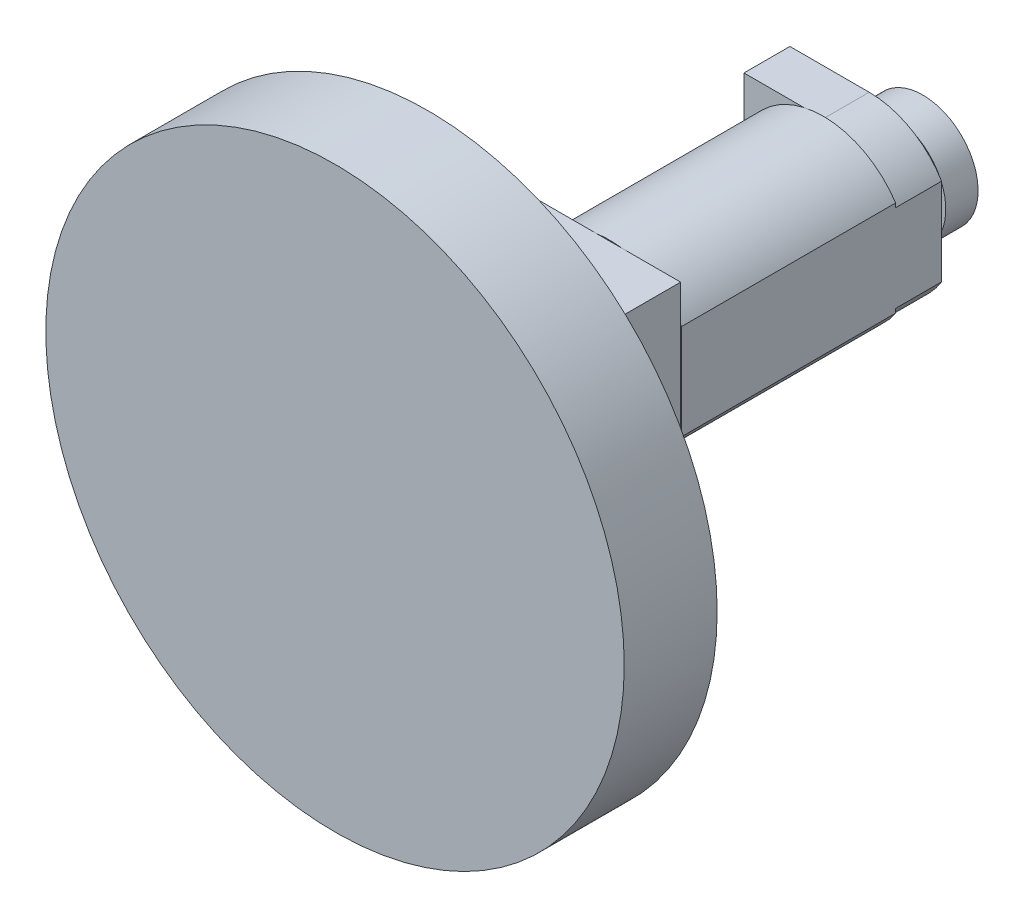
ISO-10303-21;
HEADER;
FILE_DESCRIPTION(('STEP AP214'),'2;1');
FILE_NAME('part.step','',(''),(''),'','','');
FILE_SCHEMA(('AUTOMOTIVE_DESIGN { 1 0 10303 214 1 1 1 1 }'));
ENDSEC;
DATA;
#1=APPLICATION_CONTEXT('core data for automotive mechanical design processes');
#2=APPLICATION_PROTOCOL_DEFINITION('international standard','automotive_design',2000,#1);
#3=PRODUCT_CONTEXT('',#1,'mechanical');
#4=PRODUCT('Part','Part','',(#3));
#5=PRODUCT_RELATED_PRODUCT_CATEGORY('part','',(#4));
#6=PRODUCT_DEFINITION_FORMATION('','',#4);
#7=PRODUCT_DEFINITION_CONTEXT('part definition',#1,'design');
#8=PRODUCT_DEFINITION('design','',#6,#7);
#9=PRODUCT_DEFINITION_SHAPE('','',#8);
#10=(LENGTH_UNIT() NAMED_UNIT(*) SI_UNIT(.MILLI.,.METRE.));
#11=(NAMED_UNIT(*) PLANE_ANGLE_UNIT() SI_UNIT($,.RADIAN.));
#12=(NAMED_UNIT(*) SI_UNIT($,.STERADIAN.) SOLID_ANGLE_UNIT());
#13=UNCERTAINTY_MEASURE_WITH_UNIT(LENGTH_MEASURE(1.E-05),#10,'distance_accuracy_value','');
#14=(GEOMETRIC_REPRESENTATION_CONTEXT(3) GLOBAL_UNCERTAINTY_ASSIGNED_CONTEXT((#13)) GLOBAL_UNIT_ASSIGNED_CONTEXT((#10,
#11,#12)) REPRESENTATION_CONTEXT('',''));
#15=CARTESIAN_POINT('',(0.,0.,0.));
#16=DIRECTION('',(0.,0.,1.));
#17=DIRECTION('',(1.,0.,0.));
#18=AXIS2_PLACEMENT_3D('',#15,#16,#17);
#19=CARTESIAN_POINT('',(0.,0.,0.));
#20=DIRECTION('',(0.,0.,1.));
#21=DIRECTION('',(1.,0.,0.));
#22=AXIS2_PLACEMENT_3D('',#19,#20,#21);
#23=PLANE('',#22);
#24=CARTESIAN_POINT('',(0.,0.,0.));
#25=DIRECTION('',(0.,0.,-1.));
#26=DIRECTION('',(-1.,0.,0.));
#27=AXIS2_PLACEMENT_3D('',#24,#25,#26);
#28=CIRCLE('',#27,5.842);
#29=CARTESIAN_POINT('',(0.,5.842,0.));
#30=VERTEX_POINT('',#29);
#31=CARTESIAN_POINT('',(5.0038,3.01512015680967,0.));
#32=VERTEX_POINT('',#31);
#33=EDGE_CURVE('E64',#30,#32,#28,.T.);
#34=ORIENTED_EDGE('',*,*,#33,.F.);
#35=DIRECTION('',(-1.,0.,0.));
#36=VECTOR('',#35,1.);
#37=CARTESIAN_POINT('',(0.,5.842,0.));
#38=LINE('',#37,#36);
#39=CARTESIAN_POINT('',(-1.34308129314647,5.842,0.));
#40=VERTEX_POINT('',#39);
#41=EDGE_CURVE('E223',#30,#40,#38,.T.);
#42=ORIENTED_EDGE('',*,*,#41,.T.);
#43=CARTESIAN_POINT('',(0.,0.,0.));
#44=DIRECTION('',(0.,0.,1.));
#45=DIRECTION('',(1.,0.,0.));
#46=AXIS2_PLACEMENT_3D('',#43,#44,#45);
#47=CIRCLE('',#46,5.9944);
#48=CARTESIAN_POINT('',(5.0038,3.30072975567525,0.));
#49=VERTEX_POINT('',#48);
#50=EDGE_CURVE('E329',#49,#40,#47,.T.);
#51=ORIENTED_EDGE('',*,*,#50,.F.);
#52=DIRECTION('',(0.,1.,0.));
#53=VECTOR('',#52,1.);
#54=CARTESIAN_POINT('',(5.0038,3.30072975567525,0.));
#55=LINE('',#54,#53);
#56=EDGE_CURVE('E234',#32,#49,#55,.T.);
#57=ORIENTED_EDGE('',*,*,#56,.F.);
#58=EDGE_LOOP('',(#34,#42,#51,#57));
#59=FACE_BOUND('',#58,.T.);
#60=ADVANCED_FACE('F37',(#59),#23,.F.);
#61=CARTESIAN_POINT('',(0.,0.,33.7693));
#62=DIRECTION('',(0.,0.,-1.));
#63=DIRECTION('',(-1.,0.,0.));
#64=AXIS2_PLACEMENT_3D('',#61,#62,#63);
#65=CYLINDRICAL_SURFACE('',#64,1.4732);
#66=CARTESIAN_POINT('',(0.,0.,27.3431));
#67=DIRECTION('',(0.,0.,1.));
#68=DIRECTION('',(1.,0.,0.));
#69=AXIS2_PLACEMENT_3D('',#66,#67,#68);
#70=CIRCLE('',#69,1.4732);
#71=CARTESIAN_POINT('',(1.1129722368505,-0.9652,27.3431));
#72=VERTEX_POINT('',#71);
#73=CARTESIAN_POINT('',(-1.1129722368505,-0.9652,27.3431));
#74=VERTEX_POINT('',#73);
#75=EDGE_CURVE('E255',#72,#74,#70,.T.);
#76=ORIENTED_EDGE('',*,*,#75,.F.);
#77=DIRECTION('',(0.,0.,-1.));
#78=VECTOR('',#77,1.);
#79=CARTESIAN_POINT('',(1.1129722368505,-0.9652,33.7693));
#80=LINE('',#79,#78);
#81=CARTESIAN_POINT('',(1.1129722368505,-0.9652,23.8252));
#82=VERTEX_POINT('',#81);
#83=EDGE_CURVE('E273',#72,#82,#80,.T.);
#84=ORIENTED_EDGE('',*,*,#83,.T.);
#85=CARTESIAN_POINT('',(0.,0.,23.8252));
#86=DIRECTION('',(0.,0.,1.));
#87=DIRECTION('',(1.,0.,0.));
#88=AXIS2_PLACEMENT_3D('',#85,#86,#87);
#89=CIRCLE('',#88,1.4732);
#90=CARTESIAN_POINT('',(-1.1129722368505,-0.9652,23.8252));
#91=VERTEX_POINT('',#90);
#92=EDGE_CURVE('E265',#82,#91,#89,.T.);
#93=ORIENTED_EDGE('',*,*,#92,.T.);
#94=DIRECTION('',(0.,0.,-1.));
#95=VECTOR('',#94,1.);
#96=CARTESIAN_POINT('',(-1.1129722368505,-0.9652,33.7693));
#97=LINE('',#96,#95);
#98=EDGE_CURVE('E275',#74,#91,#97,.T.);
#99=ORIENTED_EDGE('',*,*,#98,.F.);
#100=EDGE_LOOP('',(#76,#84,#93,#99));
#101=FACE_BOUND('',#100,.T.);
#102=ADVANCED_FACE('F392',(#101),#65,.T.);
#103=CARTESIAN_POINT('',(-1.1129722368505,-0.9652,33.7693));
#104=DIRECTION('',(0.,1.,0.));
#105=DIRECTION('',(0.,0.,1.));
#106=AXIS2_PLACEMENT_3D('',#103,#104,#105);
#107=PLANE('',#106);
#108=DIRECTION('',(1.,0.,0.));
#109=VECTOR('',#108,1.);
#110=CARTESIAN_POINT('',(-1.1129722368505,-0.9652,27.3431));
#111=LINE('',#110,#109);
#112=EDGE_CURVE('E258',#74,#72,#111,.T.);
#113=ORIENTED_EDGE('',*,*,#112,.F.);
#114=ORIENTED_EDGE('',*,*,#98,.T.);
#115=DIRECTION('',(1.,0.,0.));
#116=VECTOR('',#115,1.);
#117=CARTESIAN_POINT('',(-1.1129722368505,-0.9652,23.8252));
#118=LINE('',#117,#116);
#119=EDGE_CURVE('E270',#91,#82,#118,.T.);
#120=ORIENTED_EDGE('',*,*,#119,.T.);
#121=ORIENTED_EDGE('',*,*,#83,.F.);
#122=EDGE_LOOP('',(#113,#114,#120,#121));
#123=FACE_BOUND('',#122,.T.);
#124=ADVANCED_FACE('F398',(#123),#107,.F.);
#125=CARTESIAN_POINT('',(0.,0.,23.8252));
#126=DIRECTION('',(0.,0.,1.));
#127=DIRECTION('',(1.,0.,0.));
#128=AXIS2_PLACEMENT_3D('',#125,#126,#127);
#129=PLANE('',#128);
#130=DIRECTION('',(0.,-1.,0.));
#131=VECTOR('',#130,1.);
#132=CARTESIAN_POINT('',(-4.9403,5.9309,23.8252));
#133=LINE('',#132,#131);
#134=CARTESIAN_POINT('',(-4.9403,5.9309,23.8252));
#135=VERTEX_POINT('',#134);
#136=CARTESIAN_POINT('',(-4.9403,-5.9309,23.8252));
#137=VERTEX_POINT('',#136);
#138=EDGE_CURVE('E277',#135,#137,#133,.T.);
#139=ORIENTED_EDGE('',*,*,#138,.T.);
#140=DIRECTION('',(1.,0.,0.));
#141=VECTOR('',#140,1.);
#142=CARTESIAN_POINT('',(-4.9403,-5.9309,23.8252));
#143=LINE('',#142,#141);
#144=CARTESIAN_POINT('',(4.9403,-5.9309,23.8252));
#145=VERTEX_POINT('',#144);
#146=EDGE_CURVE('E280',#137,#145,#143,.T.);
#147=ORIENTED_EDGE('',*,*,#146,.T.);
#148=DIRECTION('',(0.,1.,0.));
#149=VECTOR('',#148,1.);
#150=CARTESIAN_POINT('',(4.9403,5.9309,23.8252));
#151=LINE('',#150,#149);
#152=CARTESIAN_POINT('',(4.9403,5.9309,23.8252));
#153=VERTEX_POINT('',#152);
#154=EDGE_CURVE('E283',#145,#153,#151,.T.);
#155=ORIENTED_EDGE('',*,*,#154,.T.);
#156=DIRECTION('',(-1.,0.,0.));
#157=VECTOR('',#156,1.);
#158=CARTESIAN_POINT('',(-4.9403,5.9309,23.8252));
#159=LINE('',#158,#157);
#160=EDGE_CURVE('E285',#153,#135,#159,.T.);
#161=ORIENTED_EDGE('',*,*,#160,.T.);
#162=EDGE_LOOP('',(#139,#147,#155,#161));
#163=FACE_BOUND('',#162,.T.);
#164=ORIENTED_EDGE('',*,*,#119,.F.);
#165=ORIENTED_EDGE('',*,*,#92,.F.);
#166=EDGE_LOOP('',(#164,#165));
#167=FACE_BOUND('',#166,.T.);
#168=ADVANCED_FACE('F425',(#163,#167),#129,.T.);
#169=CARTESIAN_POINT('',(0.,0.,14.8082));
#170=DIRECTION('',(0.,0.,1.));
#171=DIRECTION('',(1.,0.,0.));
#172=AXIS2_PLACEMENT_3D('',#169,#170,#171);
#173=PLANE('',#172);
#174=DIRECTION('',(0.,-1.,0.));
#175=VECTOR('',#174,1.);
#176=CARTESIAN_POINT('',(-4.9403,5.9309,14.8082));
#177=LINE('',#176,#175);
#178=CARTESIAN_POINT('',(-4.9403,3.39503568022488,14.8082));
#179=VERTEX_POINT('',#178);
#180=CARTESIAN_POINT('',(-4.9403,-3.39503568022488,14.8082));
#181=VERTEX_POINT('',#180);
#182=EDGE_CURVE('E11',#179,#181,#177,.T.);
#183=ORIENTED_EDGE('',*,*,#182,.F.);
#184=CARTESIAN_POINT('',(0.,0.,14.8082));
#185=DIRECTION('',(0.,0.,1.));
#186=DIRECTION('',(1.,0.,0.));
#187=AXIS2_PLACEMENT_3D('',#184,#185,#186);
#188=CIRCLE('',#187,5.9944);
#189=CARTESIAN_POINT('',(-5.0038,3.30072975567525,14.8082));
#190=VERTEX_POINT('',#189);
#191=EDGE_CURVE('E319',#179,#190,#188,.T.);
#192=ORIENTED_EDGE('',*,*,#191,.T.);
#193=DIRECTION('',(0.,-1.,0.));
#194=VECTOR('',#193,1.);
#195=CARTESIAN_POINT('',(-5.0038,3.30072975567525,14.8082));
#196=LINE('',#195,#194);
#197=CARTESIAN_POINT('',(-5.0038,-3.30072975567525,14.8082));
#198=VERTEX_POINT('',#197);
#199=EDGE_CURVE('E317',#190,#198,#196,.T.);
#200=ORIENTED_EDGE('',*,*,#199,.T.);
#201=CARTESIAN_POINT('',(0.,0.,14.8082));
#202=DIRECTION('',(0.,0.,1.));
#203=DIRECTION('',(1.,0.,0.));
#204=AXIS2_PLACEMENT_3D('',#201,#202,#203);
#205=CIRCLE('',#204,5.9944);
#206=EDGE_CURVE('E322',#198,#181,#205,.T.);
#207=ORIENTED_EDGE('',*,*,#206,.T.);
#208=EDGE_LOOP('',(#183,#192,#200,#207));
#209=FACE_BOUND('',#208,.T.);
#210=ADVANCED_FACE('F416',(#209),#173,.T.);
#211=DIRECTION('',(-1.,0.,0.));
#212=VECTOR('',#211,1.);
#213=CARTESIAN_POINT('',(-4.9403,5.9309,14.8082));
#214=LINE('',#213,#212);
#215=CARTESIAN_POINT('',(0.870204889666792,5.9309,14.8082));
#216=VERTEX_POINT('',#215);
#217=CARTESIAN_POINT('',(-0.870204889666792,5.9309,14.8082));
#218=VERTEX_POINT('',#217);
#219=EDGE_CURVE('E46',#216,#218,#214,.T.);
#220=ORIENTED_EDGE('',*,*,#219,.F.);
#221=EDGE_CURVE('E475',#216,#218,#188,.T.);
#222=ORIENTED_EDGE('',*,*,#221,.T.);
#223=EDGE_LOOP('',(#220,#222));
#224=FACE_BOUND('',#223,.T.);
#225=ADVANCED_FACE('F424',(#224),#173,.T.);
#226=DIRECTION('',(0.,1.,0.));
#227=VECTOR('',#226,1.);
#228=CARTESIAN_POINT('',(4.9403,5.9309,14.8082));
#229=LINE('',#228,#227);
#230=CARTESIAN_POINT('',(4.9403,-3.39503568022488,14.8082));
#231=VERTEX_POINT('',#230);
#232=CARTESIAN_POINT('',(4.9403,3.39503568022488,14.8082));
#233=VERTEX_POINT('',#232);
#234=EDGE_CURVE('E299',#231,#233,#229,.T.);
#235=ORIENTED_EDGE('',*,*,#234,.F.);
#236=CARTESIAN_POINT('',(5.0038,-3.30072975567525,14.8082));
#237=VERTEX_POINT('',#236);
#238=EDGE_CURVE('E321',#231,#237,#205,.T.);
#239=ORIENTED_EDGE('',*,*,#238,.T.);
#240=DIRECTION('',(0.,1.,0.));
#241=VECTOR('',#240,1.);
#242=CARTESIAN_POINT('',(5.0038,3.30072975567525,14.8082));
#243=LINE('',#242,#241);
#244=CARTESIAN_POINT('',(5.0038,3.30072975567525,14.8082));
#245=VERTEX_POINT('',#244);
#246=EDGE_CURVE('E325',#237,#245,#243,.T.);
#247=ORIENTED_EDGE('',*,*,#246,.T.);
#248=EDGE_CURVE('E314',#245,#233,#188,.T.);
#249=ORIENTED_EDGE('',*,*,#248,.T.);
#250=EDGE_LOOP('',(#235,#239,#247,#249));
#251=FACE_BOUND('',#250,.T.);
#252=ADVANCED_FACE('F417',(#251),#173,.T.);
#253=CARTESIAN_POINT('',(0.,0.,14.8082));
#254=DIRECTION('',(0.,0.,-1.));
#255=DIRECTION('',(-1.,0.,0.));
#256=AXIS2_PLACEMENT_3D('',#253,#254,#255);
#257=CYLINDRICAL_SURFACE('',#256,5.9944);
#258=ORIENTED_EDGE('',*,*,#50,.T.);
#259=CARTESIAN_POINT('',(-5.0038,3.30072975567525,0.));
#260=VERTEX_POINT('',#259);
#261=EDGE_CURVE('E313',#40,#260,#47,.T.);
#262=ORIENTED_EDGE('',*,*,#261,.T.);
#263=DIRECTION('',(0.,0.,-1.));
#264=VECTOR('',#263,1.);
#265=CARTESIAN_POINT('',(-5.0038,3.30072975567525,14.8082));
#266=LINE('',#265,#264);
#267=EDGE_CURVE('E344',#190,#260,#266,.T.);
#268=ORIENTED_EDGE('',*,*,#267,.F.);
#269=ORIENTED_EDGE('',*,*,#191,.F.);
#270=EDGE_CURVE('E470',#218,#179,#188,.T.);
#271=ORIENTED_EDGE('',*,*,#270,.F.);
#272=ORIENTED_EDGE('',*,*,#221,.F.);
#273=EDGE_CURVE('E318',#233,#216,#188,.T.);
#274=ORIENTED_EDGE('',*,*,#273,.F.);
#275=ORIENTED_EDGE('',*,*,#248,.F.);
#276=DIRECTION('',(0.,0.,-1.));
#277=VECTOR('',#276,1.);
#278=CARTESIAN_POINT('',(5.0038,3.30072975567525,14.8082));
#279=LINE('',#278,#277);
#280=EDGE_CURVE('E328',#245,#49,#279,.T.);
#281=ORIENTED_EDGE('',*,*,#280,.T.);
#282=EDGE_LOOP('',(#258,#262,#268,#269,#271,#272,#274,#275,#281));
#283=FACE_BOUND('',#282,.T.);
#284=ADVANCED_FACE('F39',(#283),#257,.T.);
#285=CARTESIAN_POINT('',(-5.0038,3.30072975567525,14.8082));
#286=DIRECTION('',(1.,0.,0.));
#287=DIRECTION('',(0.,0.,-1.));
#288=AXIS2_PLACEMENT_3D('',#285,#286,#287);
#289=PLANE('',#288);
#290=DIRECTION('',(0.,-1.,0.));
#291=VECTOR('',#290,1.);
#292=CARTESIAN_POINT('',(-5.0038,3.30072975567525,0.));
#293=LINE('',#292,#291);
#294=CARTESIAN_POINT('',(-5.0038,-3.30072975567525,0.));
#295=VERTEX_POINT('',#294);
#296=EDGE_CURVE('E332',#260,#295,#293,.T.);
#297=ORIENTED_EDGE('',*,*,#296,.T.);
#298=DIRECTION('',(0.,0.,-1.));
#299=VECTOR('',#298,1.);
#300=CARTESIAN_POINT('',(-5.0038,-3.30072975567525,14.8082));
#301=LINE('',#300,#299);
#302=EDGE_CURVE('E347',#198,#295,#301,.T.);
#303=ORIENTED_EDGE('',*,*,#302,.F.);
#304=ORIENTED_EDGE('',*,*,#199,.F.);
#305=ORIENTED_EDGE('',*,*,#267,.T.);
#306=EDGE_LOOP('',(#297,#303,#304,#305));
#307=FACE_BOUND('',#306,.T.);
#308=ADVANCED_FACE('F433',(#307),#289,.F.);
#309=CARTESIAN_POINT('',(0.,0.,14.8082));
#310=DIRECTION('',(0.,0.,-1.));
#311=DIRECTION('',(-1.,0.,0.));
#312=AXIS2_PLACEMENT_3D('',#309,#310,#311);
#313=CYLINDRICAL_SURFACE('',#312,5.9944);
#314=CARTESIAN_POINT('',(0.,0.,0.));
#315=DIRECTION('',(0.,0.,1.));
#316=DIRECTION('',(1.,0.,0.));
#317=AXIS2_PLACEMENT_3D('',#314,#315,#316);
#318=CIRCLE('',#317,5.9944);
#319=CARTESIAN_POINT('',(-1.34308129314647,-5.842,0.));
#320=VERTEX_POINT('',#319);
#321=EDGE_CURVE('E335',#295,#320,#318,.T.);
#322=ORIENTED_EDGE('',*,*,#321,.T.);
#323=CARTESIAN_POINT('',(5.0038,-3.30072975567525,0.));
#324=VERTEX_POINT('',#323);
#325=EDGE_CURVE('E334',#320,#324,#318,.T.);
#326=ORIENTED_EDGE('',*,*,#325,.T.);
#327=DIRECTION('',(0.,0.,-1.));
#328=VECTOR('',#327,1.);
#329=CARTESIAN_POINT('',(5.0038,-3.30072975567525,14.8082));
#330=LINE('',#329,#328);
#331=EDGE_CURVE('E349',#237,#324,#330,.T.);
#332=ORIENTED_EDGE('',*,*,#331,.F.);
#333=ORIENTED_EDGE('',*,*,#238,.F.);
#334=CARTESIAN_POINT('',(0.870204889666792,-5.9309,14.8082));
#335=VERTEX_POINT('',#334);
#336=EDGE_CURVE('E443',#335,#231,#205,.T.);
#337=ORIENTED_EDGE('',*,*,#336,.F.);
#338=CARTESIAN_POINT('',(-0.870204889666792,-5.9309,14.8082));
#339=VERTEX_POINT('',#338);
#340=EDGE_CURVE('E448',#339,#335,#205,.T.);
#341=ORIENTED_EDGE('',*,*,#340,.F.);
#342=EDGE_CURVE('E326',#181,#339,#205,.T.);
#343=ORIENTED_EDGE('',*,*,#342,.F.);
#344=ORIENTED_EDGE('',*,*,#206,.F.);
#345=ORIENTED_EDGE('',*,*,#302,.T.);
#346=EDGE_LOOP('',(#322,#326,#332,#333,#337,#341,#343,#344,#345));
#347=FACE_BOUND('',#346,.T.);
#348=ADVANCED_FACE('F421',(#347),#313,.T.);
#349=CARTESIAN_POINT('',(5.0038,3.30072975567525,14.8082));
#350=DIRECTION('',(-1.,0.,0.));
#351=DIRECTION('',(0.,0.,1.));
#352=AXIS2_PLACEMENT_3D('',#349,#350,#351);
#353=PLANE('',#352);
#354=CARTESIAN_POINT('',(5.0038,-3.01512015680968,0.));
#355=VERTEX_POINT('',#354);
#356=EDGE_CURVE('E341',#324,#355,#55,.T.);
#357=ORIENTED_EDGE('',*,*,#356,.T.);
#358=DIRECTION('',(0.,0.,1.));
#359=VECTOR('',#358,1.);
#360=CARTESIAN_POINT('',(5.0038,-3.01512015680968,-3.175));
#361=LINE('',#360,#359);
#362=CARTESIAN_POINT('',(5.0038,-3.01512015680968,-3.175));
#363=VERTEX_POINT('',#362);
#364=EDGE_CURVE('E240',#363,#355,#361,.T.);
#365=ORIENTED_EDGE('',*,*,#364,.F.);
#366=DIRECTION('',(0.,-1.,0.));
#367=VECTOR('',#366,1.);
#368=CARTESIAN_POINT('',(5.0038,3.01512015680967,-3.175));
#369=LINE('',#368,#367);
#370=CARTESIAN_POINT('',(5.0038,3.01512015680967,-3.175));
#371=VERTEX_POINT('',#370);
#372=EDGE_CURVE('E220',#371,#363,#369,.T.);
#373=ORIENTED_EDGE('',*,*,#372,.F.);
#374=DIRECTION('',(0.,0.,1.));
#375=VECTOR('',#374,1.);
#376=CARTESIAN_POINT('',(5.0038,3.01512015680967,-3.175));
#377=LINE('',#376,#375);
#378=EDGE_CURVE('E237',#371,#32,#377,.T.);
#379=ORIENTED_EDGE('',*,*,#378,.T.);
#380=ORIENTED_EDGE('',*,*,#56,.T.);
#381=ORIENTED_EDGE('',*,*,#280,.F.);
#382=ORIENTED_EDGE('',*,*,#246,.F.);
#383=ORIENTED_EDGE('',*,*,#331,.T.);
#384=EDGE_LOOP('',(#357,#365,#373,#379,#380,#381,#382,#383));
#385=FACE_BOUND('',#384,.T.);
#386=ADVANCED_FACE('F414',(#385),#353,.F.);
#387=DIRECTION('',(1.,0.,0.));
#388=VECTOR('',#387,1.);
#389=CARTESIAN_POINT('',(-4.9403,-5.9309,14.8082));
#390=LINE('',#389,#388);
#391=EDGE_CURVE('E294',#339,#335,#390,.T.);
#392=ORIENTED_EDGE('',*,*,#391,.F.);
#393=ORIENTED_EDGE('',*,*,#340,.T.);
#394=EDGE_LOOP('',(#392,#393));
#395=FACE_BOUND('',#394,.T.);
#396=ADVANCED_FACE('F405',(#395),#173,.T.);
#397=DIRECTION('',(-1.,0.,0.));
#398=VECTOR('',#397,1.);
#399=CARTESIAN_POINT('',(0.,-5.842,0.));
#400=LINE('',#399,#398);
#401=CARTESIAN_POINT('',(0.,-5.842,0.));
#402=VERTEX_POINT('',#401);
#403=EDGE_CURVE('E56',#402,#320,#400,.T.);
#404=ORIENTED_EDGE('',*,*,#403,.F.);
#405=CARTESIAN_POINT('',(0.,0.,0.));
#406=DIRECTION('',(0.,0.,-1.));
#407=DIRECTION('',(-1.,0.,0.));
#408=AXIS2_PLACEMENT_3D('',#405,#406,#407);
#409=CIRCLE('',#408,5.842);
#410=EDGE_CURVE('E211',#355,#402,#409,.T.);
#411=ORIENTED_EDGE('',*,*,#410,.F.);
#412=ORIENTED_EDGE('',*,*,#356,.F.);
#413=ORIENTED_EDGE('',*,*,#325,.F.);
#414=EDGE_LOOP('',(#404,#411,#412,#413));
#415=FACE_BOUND('',#414,.T.);
#416=ADVANCED_FACE('F394',(#415),#23,.F.);
#417=CARTESIAN_POINT('',(0.,0.,14.8082));
#418=DIRECTION('',(0.,0.,1.));
#419=DIRECTION('',(1.,0.,0.));
#420=AXIS2_PLACEMENT_3D('',#417,#418,#419);
#421=PLANE('',#420);
#422=CARTESIAN_POINT('',(4.9403,5.9309,14.8082));
#423=VERTEX_POINT('',#422);
#424=EDGE_CURVE('E293',#233,#423,#229,.T.);
#425=ORIENTED_EDGE('',*,*,#424,.F.);
#426=ORIENTED_EDGE('',*,*,#273,.T.);
#427=EDGE_CURVE('E281',#423,#216,#214,.T.);
#428=ORIENTED_EDGE('',*,*,#427,.F.);
#429=EDGE_LOOP('',(#425,#426,#428));
#430=FACE_BOUND('',#429,.T.);
#431=ADVANCED_FACE('F404',(#430),#421,.F.);
#432=CARTESIAN_POINT('',(-4.9403,5.9309,14.8082));
#433=VERTEX_POINT('',#432);
#434=EDGE_CURVE('E298',#218,#433,#214,.T.);
#435=ORIENTED_EDGE('',*,*,#434,.F.);
#436=ORIENTED_EDGE('',*,*,#270,.T.);
#437=EDGE_CURVE('E48',#433,#179,#177,.T.);
#438=ORIENTED_EDGE('',*,*,#437,.F.);
#439=EDGE_LOOP('',(#435,#436,#438));
#440=FACE_BOUND('',#439,.T.);
#441=ADVANCED_FACE('F410',(#440),#421,.F.);
#442=CARTESIAN_POINT('',(-4.9403,-5.9309,14.8082));
#443=VERTEX_POINT('',#442);
#444=EDGE_CURVE('E49',#181,#443,#177,.T.);
#445=ORIENTED_EDGE('',*,*,#444,.F.);
#446=ORIENTED_EDGE('',*,*,#342,.T.);
#447=EDGE_CURVE('E290',#443,#339,#390,.T.);
#448=ORIENTED_EDGE('',*,*,#447,.F.);
#449=EDGE_LOOP('',(#445,#446,#448));
#450=FACE_BOUND('',#449,.T.);
#451=ADVANCED_FACE('F460',(#450),#421,.F.);
#452=CARTESIAN_POINT('',(4.9403,-5.9309,14.8082));
#453=VERTEX_POINT('',#452);
#454=EDGE_CURVE('E289',#335,#453,#390,.T.);
#455=ORIENTED_EDGE('',*,*,#454,.F.);
#456=ORIENTED_EDGE('',*,*,#336,.T.);
#457=EDGE_CURVE('E295',#453,#231,#229,.T.);
#458=ORIENTED_EDGE('',*,*,#457,.F.);
#459=EDGE_LOOP('',(#455,#456,#458));
#460=FACE_BOUND('',#459,.T.);
#461=ADVANCED_FACE('F413',(#460),#421,.F.);
#462=CARTESIAN_POINT('',(-4.9403,5.9309,23.8252));
#463=DIRECTION('',(1.,0.,0.));
#464=DIRECTION('',(0.,1.,0.));
#465=AXIS2_PLACEMENT_3D('',#462,#463,#464);
#466=PLANE('',#465);
#467=ORIENTED_EDGE('',*,*,#437,.T.);
#468=ORIENTED_EDGE('',*,*,#182,.T.);
#469=ORIENTED_EDGE('',*,*,#444,.T.);
#470=DIRECTION('',(0.,0.,-1.));
#471=VECTOR('',#470,1.);
#472=CARTESIAN_POINT('',(-4.9403,-5.9309,23.8252));
#473=LINE('',#472,#471);
#474=EDGE_CURVE('E310',#137,#443,#473,.T.);
#475=ORIENTED_EDGE('',*,*,#474,.F.);
#476=ORIENTED_EDGE('',*,*,#138,.F.);
#477=DIRECTION('',(0.,0.,-1.));
#478=VECTOR('',#477,1.);
#479=CARTESIAN_POINT('',(-4.9403,5.9309,23.8252));
#480=LINE('',#479,#478);
#481=EDGE_CURVE('E286',#135,#433,#480,.T.);
#482=ORIENTED_EDGE('',*,*,#481,.T.);
#483=EDGE_LOOP('',(#467,#468,#469,#475,#476,#482));
#484=FACE_BOUND('',#483,.T.);
#485=ADVANCED_FACE('F463',(#484),#466,.F.);
#486=CARTESIAN_POINT('',(-4.9403,-5.9309,23.8252));
#487=DIRECTION('',(0.,1.,0.));
#488=DIRECTION('',(0.,0.,1.));
#489=AXIS2_PLACEMENT_3D('',#486,#487,#488);
#490=PLANE('',#489);
#491=ORIENTED_EDGE('',*,*,#447,.T.);
#492=ORIENTED_EDGE('',*,*,#391,.T.);
#493=ORIENTED_EDGE('',*,*,#454,.T.);
#494=DIRECTION('',(0.,0.,-1.));
#495=VECTOR('',#494,1.);
#496=CARTESIAN_POINT('',(4.9403,-5.9309,23.8252));
#497=LINE('',#496,#495);
#498=EDGE_CURVE('E307',#145,#453,#497,.T.);
#499=ORIENTED_EDGE('',*,*,#498,.F.);
#500=ORIENTED_EDGE('',*,*,#146,.F.);
#501=ORIENTED_EDGE('',*,*,#474,.T.);
#502=EDGE_LOOP('',(#491,#492,#493,#499,#500,#501));
#503=FACE_BOUND('',#502,.T.);
#504=ADVANCED_FACE('F454',(#503),#490,.F.);
#505=CARTESIAN_POINT('',(4.9403,5.9309,23.8252));
#506=DIRECTION('',(-1.,0.,0.));
#507=DIRECTION('',(0.,-1.,0.));
#508=AXIS2_PLACEMENT_3D('',#505,#506,#507);
#509=PLANE('',#508);
#510=ORIENTED_EDGE('',*,*,#457,.T.);
#511=ORIENTED_EDGE('',*,*,#234,.T.);
#512=ORIENTED_EDGE('',*,*,#424,.T.);
#513=DIRECTION('',(0.,0.,-1.));
#514=VECTOR('',#513,1.);
#515=CARTESIAN_POINT('',(4.9403,5.9309,23.8252));
#516=LINE('',#515,#514);
#517=EDGE_CURVE('E304',#153,#423,#516,.T.);
#518=ORIENTED_EDGE('',*,*,#517,.F.);
#519=ORIENTED_EDGE('',*,*,#154,.F.);
#520=ORIENTED_EDGE('',*,*,#498,.T.);
#521=EDGE_LOOP('',(#510,#511,#512,#518,#519,#520));
#522=FACE_BOUND('',#521,.T.);
#523=ADVANCED_FACE('F449',(#522),#509,.F.);
#524=CARTESIAN_POINT('',(-4.9403,5.9309,23.8252));
#525=DIRECTION('',(0.,-1.,0.));
#526=DIRECTION('',(0.,0.,-1.));
#527=AXIS2_PLACEMENT_3D('',#524,#525,#526);
#528=PLANE('',#527);
#529=ORIENTED_EDGE('',*,*,#427,.T.);
#530=ORIENTED_EDGE('',*,*,#219,.T.);
#531=ORIENTED_EDGE('',*,*,#434,.T.);
#532=ORIENTED_EDGE('',*,*,#481,.F.);
#533=ORIENTED_EDGE('',*,*,#160,.F.);
#534=ORIENTED_EDGE('',*,*,#517,.T.);
#535=EDGE_LOOP('',(#529,#530,#531,#532,#533,#534));
#536=FACE_BOUND('',#535,.T.);
#537=ADVANCED_FACE('F479',(#536),#528,.F.);
#538=CARTESIAN_POINT('',(0.,0.,27.3431));
#539=DIRECTION('',(0.,0.,1.));
#540=DIRECTION('',(1.,0.,0.));
#541=AXIS2_PLACEMENT_3D('',#538,#539,#540);
#542=CYLINDRICAL_SURFACE('',#541,20.0025);
#543=CARTESIAN_POINT('',(0.,0.,27.3431));
#544=DIRECTION('',(0.,0.,1.));
#545=DIRECTION('',(1.,0.,0.));
#546=AXIS2_PLACEMENT_3D('',#543,#544,#545);
#547=CIRCLE('',#546,20.0025);
#548=CARTESIAN_POINT('',(20.0025,0.,27.3431));
#549=VERTEX_POINT('',#548);
#550=EDGE_CURVE('E262',#549,#549,#547,.T.);
#551=ORIENTED_EDGE('',*,*,#550,.T.);
#552=EDGE_LOOP('',(#551));
#553=FACE_BOUND('',#552,.T.);
#554=CARTESIAN_POINT('',(0.,0.,33.7693));
#555=DIRECTION('',(0.,0.,1.));
#556=DIRECTION('',(1.,0.,0.));
#557=AXIS2_PLACEMENT_3D('',#554,#555,#556);
#558=CIRCLE('',#557,20.0025);
#559=CARTESIAN_POINT('',(20.0025,0.,33.7693));
#560=VERTEX_POINT('',#559);
#561=EDGE_CURVE('E261',#560,#560,#558,.T.);
#562=ORIENTED_EDGE('',*,*,#561,.F.);
#563=EDGE_LOOP('',(#562));
#564=FACE_BOUND('',#563,.T.);
#565=ADVANCED_FACE('F497',(#553,#564),#542,.T.);
#566=CARTESIAN_POINT('',(0.,0.,27.3431));
#567=DIRECTION('',(0.,0.,1.));
#568=DIRECTION('',(1.,0.,0.));
#569=AXIS2_PLACEMENT_3D('',#566,#567,#568);
#570=PLANE('',#569);
#571=ORIENTED_EDGE('',*,*,#112,.T.);
#572=ORIENTED_EDGE('',*,*,#75,.T.);
#573=EDGE_LOOP('',(#571,#572));
#574=FACE_BOUND('',#573,.T.);
#575=ORIENTED_EDGE('',*,*,#550,.F.);
#576=EDGE_LOOP('',(#575));
#577=FACE_BOUND('',#576,.T.);
#578=ADVANCED_FACE('F493',(#574,#577),#570,.F.);
#579=CARTESIAN_POINT('',(0.,0.,33.7693));
#580=DIRECTION('',(0.,0.,1.));
#581=DIRECTION('',(1.,0.,0.));
#582=AXIS2_PLACEMENT_3D('',#579,#580,#581);
#583=PLANE('',#582);
#584=ORIENTED_EDGE('',*,*,#561,.T.);
#585=EDGE_LOOP('',(#584));
#586=FACE_BOUND('',#585,.T.);
#587=ADVANCED_FACE('F496',(#586),#583,.T.);
#588=CARTESIAN_POINT('',(0.,5.842,-3.175));
#589=DIRECTION('',(0.,1.,0.));
#590=DIRECTION('',(0.,0.,1.));
#591=AXIS2_PLACEMENT_3D('',#588,#589,#590);
#592=PLANE('',#591);
#593=ORIENTED_EDGE('',*,*,#41,.F.);
#594=DIRECTION('',(0.,0.,1.));
#595=VECTOR('',#594,1.);
#596=CARTESIAN_POINT('',(0.,5.842,-3.175));
#597=LINE('',#596,#595);
#598=CARTESIAN_POINT('',(0.,5.842,-3.175));
#599=VERTEX_POINT('',#598);
#600=EDGE_CURVE('E208',#599,#30,#597,.T.);
#601=ORIENTED_EDGE('',*,*,#600,.F.);
#602=DIRECTION('',(-1.,0.,0.));
#603=VECTOR('',#602,1.);
#604=CARTESIAN_POINT('',(0.,5.842,-3.175));
#605=LINE('',#604,#603);
#606=CARTESIAN_POINT('',(-5.4864,5.842,-3.175));
#607=VERTEX_POINT('',#606);
#608=EDGE_CURVE('E201',#599,#607,#605,.T.);
#609=ORIENTED_EDGE('',*,*,#608,.T.);
#610=DIRECTION('',(0.,0.,1.));
#611=VECTOR('',#610,1.);
#612=CARTESIAN_POINT('',(-5.4864,5.842,-3.175));
#613=LINE('',#612,#611);
#614=CARTESIAN_POINT('',(-5.4864,5.842,0.));
#615=VERTEX_POINT('',#614);
#616=EDGE_CURVE('E185',#607,#615,#613,.T.);
#617=ORIENTED_EDGE('',*,*,#616,.T.);
#618=EDGE_CURVE('E225',#40,#615,#38,.T.);
#619=ORIENTED_EDGE('',*,*,#618,.F.);
#620=EDGE_LOOP('',(#593,#601,#609,#617,#619));
#621=FACE_BOUND('',#620,.T.);
#622=ADVANCED_FACE('F207',(#621),#592,.T.);
#623=CARTESIAN_POINT('',(0.,0.,-3.175));
#624=DIRECTION('',(0.,0.,1.));
#625=DIRECTION('',(1.,0.,0.));
#626=AXIS2_PLACEMENT_3D('',#623,#624,#625);
#627=CYLINDRICAL_SURFACE('',#626,5.842);
#628=ORIENTED_EDGE('',*,*,#33,.T.);
#629=ORIENTED_EDGE('',*,*,#378,.F.);
#630=CARTESIAN_POINT('',(0.,0.,-3.175));
#631=DIRECTION('',(0.,0.,-1.));
#632=DIRECTION('',(-1.,0.,0.));
#633=AXIS2_PLACEMENT_3D('',#630,#631,#632);
#634=CIRCLE('',#633,5.842);
#635=EDGE_CURVE('E196',#599,#371,#634,.T.);
#636=ORIENTED_EDGE('',*,*,#635,.F.);
#637=ORIENTED_EDGE('',*,*,#600,.T.);
#638=EDGE_LOOP('',(#628,#629,#636,#637));
#639=FACE_BOUND('',#638,.T.);
#640=ADVANCED_FACE('F511',(#639),#627,.T.);
#641=CARTESIAN_POINT('',(0.,0.,-3.175));
#642=DIRECTION('',(0.,0.,1.));
#643=DIRECTION('',(1.,0.,0.));
#644=AXIS2_PLACEMENT_3D('',#641,#642,#643);
#645=CYLINDRICAL_SURFACE('',#644,5.842);
#646=ORIENTED_EDGE('',*,*,#410,.T.);
#647=DIRECTION('',(0.,0.,1.));
#648=VECTOR('',#647,1.);
#649=CARTESIAN_POINT('',(0.,-5.842,-3.175));
#650=LINE('',#649,#648);
#651=CARTESIAN_POINT('',(0.,-5.842,-3.175));
#652=VERTEX_POINT('',#651);
#653=EDGE_CURVE('E246',#652,#402,#650,.T.);
#654=ORIENTED_EDGE('',*,*,#653,.F.);
#655=CARTESIAN_POINT('',(0.,0.,-3.175));
#656=DIRECTION('',(0.,0.,-1.));
#657=DIRECTION('',(-1.,0.,0.));
#658=AXIS2_PLACEMENT_3D('',#655,#656,#657);
#659=CIRCLE('',#658,5.842);
#660=EDGE_CURVE('E218',#363,#652,#659,.T.);
#661=ORIENTED_EDGE('',*,*,#660,.F.);
#662=ORIENTED_EDGE('',*,*,#364,.T.);
#663=EDGE_LOOP('',(#646,#654,#661,#662));
#664=FACE_BOUND('',#663,.T.);
#665=ADVANCED_FACE('F622',(#664),#645,.T.);
#666=CARTESIAN_POINT('',(0.,-5.842,-3.175));
#667=DIRECTION('',(0.,1.,0.));
#668=DIRECTION('',(0.,0.,1.));
#669=AXIS2_PLACEMENT_3D('',#666,#667,#668);
#670=PLANE('',#669);
#671=ORIENTED_EDGE('',*,*,#403,.T.);
#672=CARTESIAN_POINT('',(-5.4864,-5.842,0.));
#673=VERTEX_POINT('',#672);
#674=EDGE_CURVE('E227',#320,#673,#400,.T.);
#675=ORIENTED_EDGE('',*,*,#674,.T.);
#676=DIRECTION('',(0.,0.,1.));
#677=VECTOR('',#676,1.);
#678=CARTESIAN_POINT('',(-5.4864,-5.842,-3.175));
#679=LINE('',#678,#677);
#680=CARTESIAN_POINT('',(-5.4864,-5.842,-3.175));
#681=VERTEX_POINT('',#680);
#682=EDGE_CURVE('E195',#681,#673,#679,.T.);
#683=ORIENTED_EDGE('',*,*,#682,.F.);
#684=DIRECTION('',(-1.,0.,0.));
#685=VECTOR('',#684,1.);
#686=CARTESIAN_POINT('',(0.,-5.842,-3.175));
#687=LINE('',#686,#685);
#688=EDGE_CURVE('E203',#652,#681,#687,.T.);
#689=ORIENTED_EDGE('',*,*,#688,.F.);
#690=ORIENTED_EDGE('',*,*,#653,.T.);
#691=EDGE_LOOP('',(#671,#675,#683,#689,#690));
#692=FACE_BOUND('',#691,.T.);
#693=ADVANCED_FACE('F631',(#692),#670,.F.);
#694=CARTESIAN_POINT('',(-5.4864,5.842,-3.175));
#695=DIRECTION('',(-1.,0.,0.));
#696=DIRECTION('',(0.,0.,1.));
#697=AXIS2_PLACEMENT_3D('',#694,#695,#696);
#698=PLANE('',#697);
#699=DIRECTION('',(0.,-1.,0.));
#700=VECTOR('',#699,1.);
#701=CARTESIAN_POINT('',(-5.4864,5.842,0.));
#702=LINE('',#701,#700);
#703=EDGE_CURVE('E191',#615,#673,#702,.T.);
#704=ORIENTED_EDGE('',*,*,#703,.F.);
#705=ORIENTED_EDGE('',*,*,#616,.F.);
#706=DIRECTION('',(0.,-1.,0.));
#707=VECTOR('',#706,1.);
#708=CARTESIAN_POINT('',(-5.4864,5.842,-3.175));
#709=LINE('',#708,#707);
#710=EDGE_CURVE('E189',#607,#681,#709,.T.);
#711=ORIENTED_EDGE('',*,*,#710,.T.);
#712=ORIENTED_EDGE('',*,*,#682,.T.);
#713=EDGE_LOOP('',(#704,#705,#711,#712));
#714=FACE_BOUND('',#713,.T.);
#715=ADVANCED_FACE('F187',(#714),#698,.T.);
#716=CARTESIAN_POINT('',(0.,0.,-3.175));
#717=DIRECTION('',(0.,0.,-1.));
#718=DIRECTION('',(-1.,0.,0.));
#719=AXIS2_PLACEMENT_3D('',#716,#717,#718);
#720=PLANE('',#719);
#721=CARTESIAN_POINT('',(0.,0.,-3.175));
#722=DIRECTION('',(0.,0.,-1.));
#723=DIRECTION('',(-1.,0.,0.));
#724=AXIS2_PLACEMENT_3D('',#721,#722,#723);
#725=CIRCLE('',#724,0.254);
#726=CARTESIAN_POINT('',(-0.254,0.,-3.175));
#727=VERTEX_POINT('',#726);
#728=EDGE_CURVE('E214',#727,#727,#725,.T.);
#729=ORIENTED_EDGE('',*,*,#728,.F.);
#730=EDGE_LOOP('',(#729));
#731=FACE_BOUND('',#730,.T.);
#732=ORIENTED_EDGE('',*,*,#608,.F.);
#733=ORIENTED_EDGE('',*,*,#635,.T.);
#734=ORIENTED_EDGE('',*,*,#372,.T.);
#735=ORIENTED_EDGE('',*,*,#660,.T.);
#736=ORIENTED_EDGE('',*,*,#688,.T.);
#737=ORIENTED_EDGE('',*,*,#710,.F.);
#738=EDGE_LOOP('',(#732,#733,#734,#735,#736,#737));
#739=FACE_BOUND('',#738,.T.);
#740=ADVANCED_FACE('F200',(#731,#739),#720,.T.);
#741=CARTESIAN_POINT('',(0.,0.,0.));
#742=DIRECTION('',(0.,0.,-1.));
#743=DIRECTION('',(-1.,0.,0.));
#744=AXIS2_PLACEMENT_3D('',#741,#742,#743);
#745=PLANE('',#744);
#746=ORIENTED_EDGE('',*,*,#261,.F.);
#747=ORIENTED_EDGE('',*,*,#618,.T.);
#748=ORIENTED_EDGE('',*,*,#703,.T.);
#749=ORIENTED_EDGE('',*,*,#674,.F.);
#750=ORIENTED_EDGE('',*,*,#321,.F.);
#751=ORIENTED_EDGE('',*,*,#296,.F.);
#752=EDGE_LOOP('',(#746,#747,#748,#749,#750,#751));
#753=FACE_BOUND('',#752,.T.);
#754=ADVANCED_FACE('F654',(#753),#745,.F.);
#755=CARTESIAN_POINT('',(0.,0.,-4.6482));
#756=DIRECTION('',(0.,0.,1.));
#757=DIRECTION('',(1.,0.,0.));
#758=AXIS2_PLACEMENT_3D('',#755,#756,#757);
#759=CYLINDRICAL_SURFACE('',#758,0.254);
#760=CARTESIAN_POINT('',(0.,0.,-4.6482));
#761=DIRECTION('',(0.,0.,-1.));
#762=DIRECTION('',(-1.,0.,0.));
#763=AXIS2_PLACEMENT_3D('',#760,#761,#762);
#764=CIRCLE('',#763,0.254);
#765=CARTESIAN_POINT('',(-0.254,0.,-4.6482));
#766=VERTEX_POINT('',#765);
#767=EDGE_CURVE('E362',#766,#766,#764,.T.);
#768=ORIENTED_EDGE('',*,*,#767,.F.);
#769=EDGE_LOOP('',(#768));
#770=FACE_BOUND('',#769,.T.);
#771=ORIENTED_EDGE('',*,*,#728,.T.);
#772=EDGE_LOOP('',(#771));
#773=FACE_BOUND('',#772,.T.);
#774=ADVANCED_FACE('F380',(#770,#773),#759,.T.);
#775=CARTESIAN_POINT('',(0.,0.,-6.8834));
#776=DIRECTION('',(0.,0.,1.));
#777=DIRECTION('',(1.,0.,0.));
#778=AXIS2_PLACEMENT_3D('',#775,#776,#777);
#779=CYLINDRICAL_SURFACE('',#778,3.8227);
#780=CARTESIAN_POINT('',(0.,0.,-6.8834));
#781=DIRECTION('',(0.,0.,-1.));
#782=DIRECTION('',(-1.,0.,0.));
#783=AXIS2_PLACEMENT_3D('',#780,#781,#782);
#784=CIRCLE('',#783,3.8227);
#785=CARTESIAN_POINT('',(-3.8227,0.,-6.8834));
#786=VERTEX_POINT('',#785);
#787=EDGE_CURVE('E367',#786,#786,#784,.T.);
#788=ORIENTED_EDGE('',*,*,#787,.F.);
#789=EDGE_LOOP('',(#788));
#790=FACE_BOUND('',#789,.T.);
#791=CARTESIAN_POINT('',(0.,0.,-4.6482));
#792=DIRECTION('',(0.,0.,-1.));
#793=DIRECTION('',(-1.,0.,0.));
#794=AXIS2_PLACEMENT_3D('',#791,#792,#793);
#795=CIRCLE('',#794,3.8227);
#796=CARTESIAN_POINT('',(-3.8227,0.,-4.6482));
#797=VERTEX_POINT('',#796);
#798=EDGE_CURVE('E369',#797,#797,#795,.T.);
#799=ORIENTED_EDGE('',*,*,#798,.T.);
#800=EDGE_LOOP('',(#799));
#801=FACE_BOUND('',#800,.T.);
#802=ADVANCED_FACE('F377',(#790,#801),#779,.T.);
#803=CARTESIAN_POINT('',(0.,0.,-6.8834));
#804=DIRECTION('',(0.,0.,-1.));
#805=DIRECTION('',(-1.,0.,0.));
#806=AXIS2_PLACEMENT_3D('',#803,#804,#805);
#807=PLANE('',#806);
#808=ORIENTED_EDGE('',*,*,#787,.T.);
#809=EDGE_LOOP('',(#808));
#810=FACE_BOUND('',#809,.T.);
#811=ADVANCED_FACE('F375',(#810),#807,.T.);
#812=CARTESIAN_POINT('',(0.,0.,-4.6482));
#813=DIRECTION('',(0.,0.,-1.));
#814=DIRECTION('',(-1.,0.,0.));
#815=AXIS2_PLACEMENT_3D('',#812,#813,#814);
#816=PLANE('',#815);
#817=ORIENTED_EDGE('',*,*,#767,.T.);
#818=EDGE_LOOP('',(#817));
#819=FACE_BOUND('',#818,.T.);
#820=ORIENTED_EDGE('',*,*,#798,.F.);
#821=EDGE_LOOP('',(#820));
#822=FACE_BOUND('',#821,.T.);
#823=ADVANCED_FACE('F384',(#819,#822),#816,.F.);
#824=CLOSED_SHELL('',(#60,#102,#124,#168,#210,#225,#252,#284,#308,#348,#386,#396,#416,#431,#441,
#451,#461,#485,#504,#523,#537,#565,#578,#587,#622,#640,#665,#693,#715,#740,#754,#774,#802,#811,#823));
#825=MANIFOLD_SOLID_BREP('B2',#824);
#826=ADVANCED_BREP_SHAPE_REPRESENTATION('',(#18,#825),#14);
#827=SHAPE_DEFINITION_REPRESENTATION(#9,#826);
ENDSEC;
END-ISO-10303-21;
